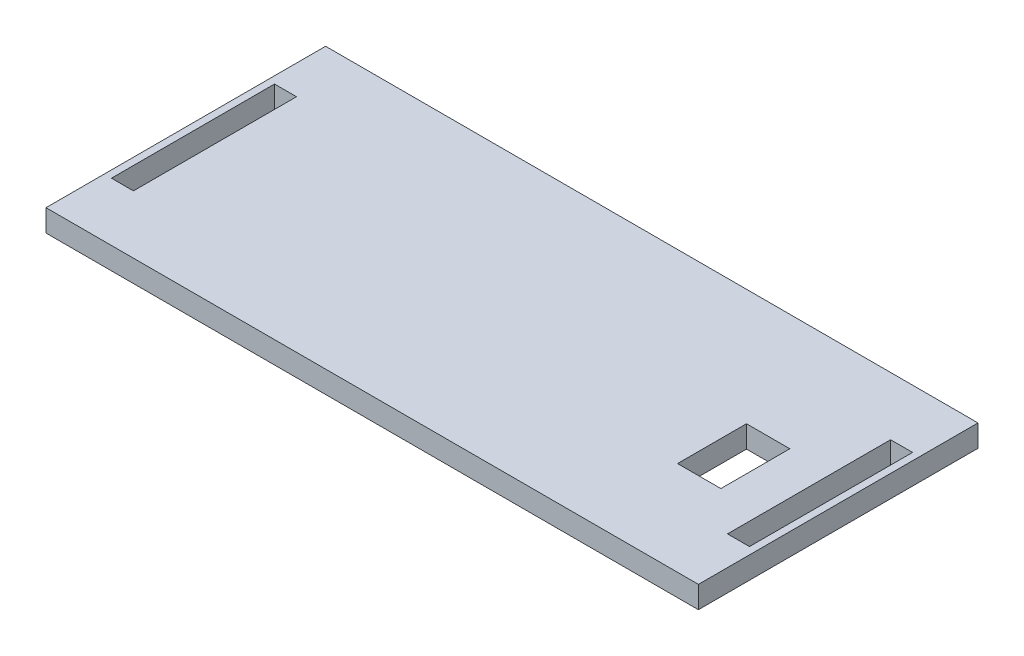
ISO-10303-21;
HEADER;
FILE_DESCRIPTION(('STEP AP214'),'2;1');
FILE_NAME('part.step','',(''),(''),'','','');
FILE_SCHEMA(('AUTOMOTIVE_DESIGN { 1 0 10303 214 1 1 1 1 }'));
ENDSEC;
DATA;
#1=APPLICATION_CONTEXT('core data for automotive mechanical design processes');
#2=APPLICATION_PROTOCOL_DEFINITION('international standard','automotive_design',2000,#1);
#3=PRODUCT_CONTEXT('',#1,'mechanical');
#4=PRODUCT('Part','Part','',(#3));
#5=PRODUCT_RELATED_PRODUCT_CATEGORY('part','',(#4));
#6=PRODUCT_DEFINITION_FORMATION('','',#4);
#7=PRODUCT_DEFINITION_CONTEXT('part definition',#1,'design');
#8=PRODUCT_DEFINITION('design','',#6,#7);
#9=PRODUCT_DEFINITION_SHAPE('','',#8);
#10=(LENGTH_UNIT() NAMED_UNIT(*) SI_UNIT(.MILLI.,.METRE.));
#11=(NAMED_UNIT(*) PLANE_ANGLE_UNIT() SI_UNIT($,.RADIAN.));
#12=(NAMED_UNIT(*) SI_UNIT($,.STERADIAN.) SOLID_ANGLE_UNIT());
#13=UNCERTAINTY_MEASURE_WITH_UNIT(LENGTH_MEASURE(1.E-05),#10,'distance_accuracy_value','');
#14=(GEOMETRIC_REPRESENTATION_CONTEXT(3) GLOBAL_UNCERTAINTY_ASSIGNED_CONTEXT((#13)) GLOBAL_UNIT_ASSIGNED_CONTEXT((#10,
#11,#12)) REPRESENTATION_CONTEXT('',''));
#15=CARTESIAN_POINT('',(0.,0.,0.));
#16=DIRECTION('',(0.,0.,1.));
#17=DIRECTION('',(1.,0.,0.));
#18=AXIS2_PLACEMENT_3D('',#15,#16,#17);
#19=CARTESIAN_POINT('',(0.,5.9944,0.));
#20=DIRECTION('',(0.,1.,0.));
#21=DIRECTION('',(0.,0.,1.));
#22=AXIS2_PLACEMENT_3D('',#19,#20,#21);
#23=PLANE('',#22);
#24=DIRECTION('',(0.,0.,1.));
#25=VECTOR('',#24,1.);
#26=CARTESIAN_POINT('',(0.,5.9944,0.));
#27=LINE('',#26,#25);
#28=CARTESIAN_POINT('',(0.,5.9944,0.));
#29=VERTEX_POINT('',#28);
#30=CARTESIAN_POINT('',(0.,5.9944,76.2));
#31=VERTEX_POINT('',#30);
#32=EDGE_CURVE('E291',#29,#31,#27,.T.);
#33=ORIENTED_EDGE('',*,*,#32,.T.);
#34=DIRECTION('',(1.,0.,0.));
#35=VECTOR('',#34,1.);
#36=CARTESIAN_POINT('',(0.,5.9944,76.2));
#37=LINE('',#36,#35);
#38=CARTESIAN_POINT('',(177.8,5.9944,76.2));
#39=VERTEX_POINT('',#38);
#40=EDGE_CURVE('E295',#31,#39,#37,.T.);
#41=ORIENTED_EDGE('',*,*,#40,.T.);
#42=DIRECTION('',(0.,0.,-1.));
#43=VECTOR('',#42,1.);
#44=CARTESIAN_POINT('',(177.8,5.9944,0.));
#45=LINE('',#44,#43);
#46=CARTESIAN_POINT('',(177.8,5.9944,0.));
#47=VERTEX_POINT('',#46);
#48=EDGE_CURVE('E299',#39,#47,#45,.T.);
#49=ORIENTED_EDGE('',*,*,#48,.T.);
#50=DIRECTION('',(-1.,0.,0.));
#51=VECTOR('',#50,1.);
#52=CARTESIAN_POINT('',(0.,5.9944,0.));
#53=LINE('',#52,#51);
#54=EDGE_CURVE('E302',#47,#29,#53,.T.);
#55=ORIENTED_EDGE('',*,*,#54,.T.);
#56=EDGE_LOOP('',(#33,#41,#49,#55));
#57=FACE_BOUND('',#56,.T.);
#58=DIRECTION('',(1.,0.,0.));
#59=VECTOR('',#58,1.);
#60=CARTESIAN_POINT('',(1.95480000200001,5.9944,60.325));
#61=LINE('',#60,#59);
#62=CARTESIAN_POINT('',(1.95480000200001,5.9944,60.325));
#63=VERTEX_POINT('',#62);
#64=CARTESIAN_POINT('',(7.94920000200001,5.9944,60.325));
#65=VERTEX_POINT('',#64);
#66=EDGE_CURVE('E251',#63,#65,#61,.T.);
#67=ORIENTED_EDGE('',*,*,#66,.F.);
#68=DIRECTION('',(0.,0.,1.));
#69=VECTOR('',#68,1.);
#70=CARTESIAN_POINT('',(1.95480000200001,5.9944,15.875));
#71=LINE('',#70,#69);
#72=CARTESIAN_POINT('',(1.95480000200001,5.9944,15.875));
#73=VERTEX_POINT('',#72);
#74=EDGE_CURVE('E248',#73,#63,#71,.T.);
#75=ORIENTED_EDGE('',*,*,#74,.F.);
#76=DIRECTION('',(-1.,0.,0.));
#77=VECTOR('',#76,1.);
#78=CARTESIAN_POINT('',(1.95480000200001,5.9944,15.875));
#79=LINE('',#78,#77);
#80=CARTESIAN_POINT('',(7.94920000200001,5.9944,15.875));
#81=VERTEX_POINT('',#80);
#82=EDGE_CURVE('E259',#81,#73,#79,.T.);
#83=ORIENTED_EDGE('',*,*,#82,.F.);
#84=DIRECTION('',(0.,0.,-1.));
#85=VECTOR('',#84,1.);
#86=CARTESIAN_POINT('',(7.94920000200001,5.9944,15.875));
#87=LINE('',#86,#85);
#88=EDGE_CURVE('E255',#65,#81,#87,.T.);
#89=ORIENTED_EDGE('',*,*,#88,.F.);
#90=EDGE_LOOP('',(#67,#75,#83,#89));
#91=FACE_BOUND('',#90,.T.);
#92=DIRECTION('',(-1.,0.,0.));
#93=VECTOR('',#92,1.);
#94=CARTESIAN_POINT('',(175.845199998,5.9944,15.875));
#95=LINE('',#94,#93);
#96=CARTESIAN_POINT('',(175.845199998,5.9944,15.875));
#97=VERTEX_POINT('',#96);
#98=CARTESIAN_POINT('',(169.850799998,5.9944,15.875));
#99=VERTEX_POINT('',#98);
#100=EDGE_CURVE('E208',#97,#99,#95,.T.);
#101=ORIENTED_EDGE('',*,*,#100,.F.);
#102=DIRECTION('',(0.,0.,-1.));
#103=VECTOR('',#102,1.);
#104=CARTESIAN_POINT('',(175.845199998,5.9944,15.875));
#105=LINE('',#104,#103);
#106=CARTESIAN_POINT('',(175.845199998,5.9944,60.325));
#107=VERTEX_POINT('',#106);
#108=EDGE_CURVE('E205',#107,#97,#105,.T.);
#109=ORIENTED_EDGE('',*,*,#108,.F.);
#110=DIRECTION('',(1.,0.,0.));
#111=VECTOR('',#110,1.);
#112=CARTESIAN_POINT('',(175.845199998,5.9944,60.325));
#113=LINE('',#112,#111);
#114=CARTESIAN_POINT('',(169.850799998,5.9944,60.325));
#115=VERTEX_POINT('',#114);
#116=EDGE_CURVE('E216',#115,#107,#113,.T.);
#117=ORIENTED_EDGE('',*,*,#116,.F.);
#118=DIRECTION('',(0.,0.,1.));
#119=VECTOR('',#118,1.);
#120=CARTESIAN_POINT('',(169.850799998,5.9944,15.875));
#121=LINE('',#120,#119);
#122=EDGE_CURVE('E212',#99,#115,#121,.T.);
#123=ORIENTED_EDGE('',*,*,#122,.F.);
#124=EDGE_LOOP('',(#101,#109,#117,#123));
#125=FACE_BOUND('',#124,.T.);
#126=DIRECTION('',(-1.,0.,0.));
#127=VECTOR('',#126,1.);
#128=CARTESIAN_POINT('',(158.255699998,5.9944,31.7373));
#129=LINE('',#128,#127);
#130=CARTESIAN_POINT('',(158.255699998,5.9944,31.7373));
#131=VERTEX_POINT('',#130);
#132=CARTESIAN_POINT('',(146.444699998,5.9944,31.7373));
#133=VERTEX_POINT('',#132);
#134=EDGE_CURVE('E166',#131,#133,#129,.T.);
#135=ORIENTED_EDGE('',*,*,#134,.F.);
#136=DIRECTION('',(0.,0.,-1.));
#137=VECTOR('',#136,1.);
#138=CARTESIAN_POINT('',(158.255699998,5.9944,31.7373));
#139=LINE('',#138,#137);
#140=CARTESIAN_POINT('',(158.255699998,5.9944,50.5333));
#141=VERTEX_POINT('',#140);
#142=EDGE_CURVE('E157',#141,#131,#139,.T.);
#143=ORIENTED_EDGE('',*,*,#142,.F.);
#144=DIRECTION('',(1.,0.,0.));
#145=VECTOR('',#144,1.);
#146=CARTESIAN_POINT('',(158.255699998,5.9944,50.5333));
#147=LINE('',#146,#145);
#148=CARTESIAN_POINT('',(146.444699998,5.9944,50.5333));
#149=VERTEX_POINT('',#148);
#150=EDGE_CURVE('E183',#149,#141,#147,.T.);
#151=ORIENTED_EDGE('',*,*,#150,.F.);
#152=DIRECTION('',(0.,0.,1.));
#153=VECTOR('',#152,1.);
#154=CARTESIAN_POINT('',(146.444699998,5.9944,31.7373));
#155=LINE('',#154,#153);
#156=EDGE_CURVE('E179',#133,#149,#155,.T.);
#157=ORIENTED_EDGE('',*,*,#156,.F.);
#158=EDGE_LOOP('',(#135,#143,#151,#157));
#159=FACE_BOUND('',#158,.T.);
#160=ADVANCED_FACE('F43',(#57,#91,#125,#159),#23,.T.);
#161=CARTESIAN_POINT('',(0.,0.,0.));
#162=DIRECTION('',(0.,1.,0.));
#163=DIRECTION('',(0.,0.,1.));
#164=AXIS2_PLACEMENT_3D('',#161,#162,#163);
#165=PLANE('',#164);
#166=DIRECTION('',(0.,0.,-1.));
#167=VECTOR('',#166,1.);
#168=CARTESIAN_POINT('',(175.845199998,0.,15.875));
#169=LINE('',#168,#167);
#170=CARTESIAN_POINT('',(175.845199998,0.,60.325));
#171=VERTEX_POINT('',#170);
#172=CARTESIAN_POINT('',(175.845199998,0.,15.875));
#173=VERTEX_POINT('',#172);
#174=EDGE_CURVE('E175',#171,#173,#169,.T.);
#175=ORIENTED_EDGE('',*,*,#174,.T.);
#176=DIRECTION('',(-1.,0.,0.));
#177=VECTOR('',#176,1.);
#178=CARTESIAN_POINT('',(175.845199998,0.,15.875));
#179=LINE('',#178,#177);
#180=CARTESIAN_POINT('',(169.850799998,0.,15.875));
#181=VERTEX_POINT('',#180);
#182=EDGE_CURVE('E223',#173,#181,#179,.T.);
#183=ORIENTED_EDGE('',*,*,#182,.T.);
#184=DIRECTION('',(0.,0.,1.));
#185=VECTOR('',#184,1.);
#186=CARTESIAN_POINT('',(169.850799998,0.,15.875));
#187=LINE('',#186,#185);
#188=CARTESIAN_POINT('',(169.850799998,0.,60.325));
#189=VERTEX_POINT('',#188);
#190=EDGE_CURVE('E227',#181,#189,#187,.T.);
#191=ORIENTED_EDGE('',*,*,#190,.T.);
#192=DIRECTION('',(1.,0.,0.));
#193=VECTOR('',#192,1.);
#194=CARTESIAN_POINT('',(175.845199998,0.,60.325));
#195=LINE('',#194,#193);
#196=EDGE_CURVE('E209',#189,#171,#195,.T.);
#197=ORIENTED_EDGE('',*,*,#196,.T.);
#198=EDGE_LOOP('',(#175,#183,#191,#197));
#199=FACE_BOUND('',#198,.T.);
#200=DIRECTION('',(0.,0.,1.));
#201=VECTOR('',#200,1.);
#202=CARTESIAN_POINT('',(0.,0.,0.));
#203=LINE('',#202,#201);
#204=CARTESIAN_POINT('',(0.,0.,0.));
#205=VERTEX_POINT('',#204);
#206=CARTESIAN_POINT('',(0.,0.,76.2));
#207=VERTEX_POINT('',#206);
#208=EDGE_CURVE('E290',#205,#207,#203,.T.);
#209=ORIENTED_EDGE('',*,*,#208,.F.);
#210=DIRECTION('',(-1.,0.,0.));
#211=VECTOR('',#210,1.);
#212=CARTESIAN_POINT('',(0.,0.,0.));
#213=LINE('',#212,#211);
#214=CARTESIAN_POINT('',(177.8,0.,0.));
#215=VERTEX_POINT('',#214);
#216=EDGE_CURVE('E296',#215,#205,#213,.T.);
#217=ORIENTED_EDGE('',*,*,#216,.F.);
#218=DIRECTION('',(0.,0.,-1.));
#219=VECTOR('',#218,1.);
#220=CARTESIAN_POINT('',(177.8,0.,0.));
#221=LINE('',#220,#219);
#222=CARTESIAN_POINT('',(177.8,0.,76.2));
#223=VERTEX_POINT('',#222);
#224=EDGE_CURVE('E312',#223,#215,#221,.T.);
#225=ORIENTED_EDGE('',*,*,#224,.F.);
#226=DIRECTION('',(1.,0.,0.));
#227=VECTOR('',#226,1.);
#228=CARTESIAN_POINT('',(0.,0.,76.2));
#229=LINE('',#228,#227);
#230=EDGE_CURVE('E309',#207,#223,#229,.T.);
#231=ORIENTED_EDGE('',*,*,#230,.F.);
#232=EDGE_LOOP('',(#209,#217,#225,#231));
#233=FACE_BOUND('',#232,.T.);
#234=DIRECTION('',(0.,0.,1.));
#235=VECTOR('',#234,1.);
#236=CARTESIAN_POINT('',(1.95480000200001,0.,15.875));
#237=LINE('',#236,#235);
#238=CARTESIAN_POINT('',(1.95480000200001,0.,15.875));
#239=VERTEX_POINT('',#238);
#240=CARTESIAN_POINT('',(1.95480000200001,0.,60.325));
#241=VERTEX_POINT('',#240);
#242=EDGE_CURVE('E247',#239,#241,#237,.T.);
#243=ORIENTED_EDGE('',*,*,#242,.T.);
#244=DIRECTION('',(1.,0.,0.));
#245=VECTOR('',#244,1.);
#246=CARTESIAN_POINT('',(1.95480000200001,0.,60.325));
#247=LINE('',#246,#245);
#248=CARTESIAN_POINT('',(7.94920000200001,0.,60.325));
#249=VERTEX_POINT('',#248);
#250=EDGE_CURVE('E266',#241,#249,#247,.T.);
#251=ORIENTED_EDGE('',*,*,#250,.T.);
#252=DIRECTION('',(0.,0.,-1.));
#253=VECTOR('',#252,1.);
#254=CARTESIAN_POINT('',(7.94920000200001,0.,15.875));
#255=LINE('',#254,#253);
#256=CARTESIAN_POINT('',(7.94920000200001,0.,15.875));
#257=VERTEX_POINT('',#256);
#258=EDGE_CURVE('E270',#249,#257,#255,.T.);
#259=ORIENTED_EDGE('',*,*,#258,.T.);
#260=DIRECTION('',(-1.,0.,0.));
#261=VECTOR('',#260,1.);
#262=CARTESIAN_POINT('',(1.95480000200001,0.,15.875));
#263=LINE('',#262,#261);
#264=EDGE_CURVE('E252',#257,#239,#263,.T.);
#265=ORIENTED_EDGE('',*,*,#264,.T.);
#266=EDGE_LOOP('',(#243,#251,#259,#265));
#267=FACE_BOUND('',#266,.T.);
#268=DIRECTION('',(0.,0.,-1.));
#269=VECTOR('',#268,1.);
#270=CARTESIAN_POINT('',(158.255699998,0.,31.7373));
#271=LINE('',#270,#269);
#272=CARTESIAN_POINT('',(158.255699998,0.,50.5333));
#273=VERTEX_POINT('',#272);
#274=CARTESIAN_POINT('',(158.255699998,0.,31.7373));
#275=VERTEX_POINT('',#274);
#276=EDGE_CURVE('E67',#273,#275,#271,.T.);
#277=ORIENTED_EDGE('',*,*,#276,.T.);
#278=DIRECTION('',(-1.,0.,0.));
#279=VECTOR('',#278,1.);
#280=CARTESIAN_POINT('',(158.255699998,0.,31.7373));
#281=LINE('',#280,#279);
#282=CARTESIAN_POINT('',(146.444699998,0.,31.7373));
#283=VERTEX_POINT('',#282);
#284=EDGE_CURVE('E173',#275,#283,#281,.T.);
#285=ORIENTED_EDGE('',*,*,#284,.T.);
#286=DIRECTION('',(0.,0.,1.));
#287=VECTOR('',#286,1.);
#288=CARTESIAN_POINT('',(146.444699998,0.,31.7373));
#289=LINE('',#288,#287);
#290=CARTESIAN_POINT('',(146.444699998,0.,50.5333));
#291=VERTEX_POINT('',#290);
#292=EDGE_CURVE('E192',#283,#291,#289,.T.);
#293=ORIENTED_EDGE('',*,*,#292,.T.);
#294=DIRECTION('',(1.,0.,0.));
#295=VECTOR('',#294,1.);
#296=CARTESIAN_POINT('',(158.255699998,0.,50.5333));
#297=LINE('',#296,#295);
#298=EDGE_CURVE('E167',#291,#273,#297,.T.);
#299=ORIENTED_EDGE('',*,*,#298,.T.);
#300=EDGE_LOOP('',(#277,#285,#293,#299));
#301=FACE_BOUND('',#300,.T.);
#302=ADVANCED_FACE('F335',(#199,#233,#267,#301),#165,.F.);
#303=CARTESIAN_POINT('',(0.,5.9944,0.));
#304=DIRECTION('',(1.,0.,0.));
#305=DIRECTION('',(0.,0.,-1.));
#306=AXIS2_PLACEMENT_3D('',#303,#304,#305);
#307=PLANE('',#306);
#308=ORIENTED_EDGE('',*,*,#208,.T.);
#309=DIRECTION('',(0.,-1.,0.));
#310=VECTOR('',#309,1.);
#311=CARTESIAN_POINT('',(0.,5.9944,76.2));
#312=LINE('',#311,#310);
#313=EDGE_CURVE('E11',#31,#207,#312,.T.);
#314=ORIENTED_EDGE('',*,*,#313,.F.);
#315=ORIENTED_EDGE('',*,*,#32,.F.);
#316=DIRECTION('',(0.,-1.,0.));
#317=VECTOR('',#316,1.);
#318=CARTESIAN_POINT('',(0.,5.9944,0.));
#319=LINE('',#318,#317);
#320=EDGE_CURVE('E305',#29,#205,#319,.T.);
#321=ORIENTED_EDGE('',*,*,#320,.T.);
#322=EDGE_LOOP('',(#308,#314,#315,#321));
#323=FACE_BOUND('',#322,.T.);
#324=ADVANCED_FACE('F45',(#323),#307,.F.);
#325=CARTESIAN_POINT('',(0.,5.9944,76.2));
#326=DIRECTION('',(0.,0.,-1.));
#327=DIRECTION('',(-1.,0.,0.));
#328=AXIS2_PLACEMENT_3D('',#325,#326,#327);
#329=PLANE('',#328);
#330=ORIENTED_EDGE('',*,*,#230,.T.);
#331=DIRECTION('',(0.,-1.,0.));
#332=VECTOR('',#331,1.);
#333=CARTESIAN_POINT('',(177.8,5.9944,76.2));
#334=LINE('',#333,#332);
#335=EDGE_CURVE('E52',#39,#223,#334,.T.);
#336=ORIENTED_EDGE('',*,*,#335,.F.);
#337=ORIENTED_EDGE('',*,*,#40,.F.);
#338=ORIENTED_EDGE('',*,*,#313,.T.);
#339=EDGE_LOOP('',(#330,#336,#337,#338));
#340=FACE_BOUND('',#339,.T.);
#341=ADVANCED_FACE('F346',(#340),#329,.F.);
#342=CARTESIAN_POINT('',(177.8,5.9944,0.));
#343=DIRECTION('',(-1.,0.,0.));
#344=DIRECTION('',(0.,0.,1.));
#345=AXIS2_PLACEMENT_3D('',#342,#343,#344);
#346=PLANE('',#345);
#347=ORIENTED_EDGE('',*,*,#224,.T.);
#348=DIRECTION('',(0.,-1.,0.));
#349=VECTOR('',#348,1.);
#350=CARTESIAN_POINT('',(177.8,5.9944,0.));
#351=LINE('',#350,#349);
#352=EDGE_CURVE('E320',#47,#215,#351,.T.);
#353=ORIENTED_EDGE('',*,*,#352,.F.);
#354=ORIENTED_EDGE('',*,*,#48,.F.);
#355=ORIENTED_EDGE('',*,*,#335,.T.);
#356=EDGE_LOOP('',(#347,#353,#354,#355));
#357=FACE_BOUND('',#356,.T.);
#358=ADVANCED_FACE('F329',(#357),#346,.F.);
#359=CARTESIAN_POINT('',(0.,5.9944,0.));
#360=DIRECTION('',(0.,0.,1.));
#361=DIRECTION('',(1.,0.,0.));
#362=AXIS2_PLACEMENT_3D('',#359,#360,#361);
#363=PLANE('',#362);
#364=ORIENTED_EDGE('',*,*,#216,.T.);
#365=ORIENTED_EDGE('',*,*,#320,.F.);
#366=ORIENTED_EDGE('',*,*,#54,.F.);
#367=ORIENTED_EDGE('',*,*,#352,.T.);
#368=EDGE_LOOP('',(#364,#365,#366,#367));
#369=FACE_BOUND('',#368,.T.);
#370=ADVANCED_FACE('F339',(#369),#363,.F.);
#371=CARTESIAN_POINT('',(1.95480000200001,5.9944,15.875));
#372=DIRECTION('',(1.,0.,0.));
#373=DIRECTION('',(0.,0.,-1.));
#374=AXIS2_PLACEMENT_3D('',#371,#372,#373);
#375=PLANE('',#374);
#376=ORIENTED_EDGE('',*,*,#242,.F.);
#377=DIRECTION('',(0.,-1.,0.));
#378=VECTOR('',#377,1.);
#379=CARTESIAN_POINT('',(1.95480000200001,5.9944,15.875));
#380=LINE('',#379,#378);
#381=EDGE_CURVE('E262',#73,#239,#380,.T.);
#382=ORIENTED_EDGE('',*,*,#381,.F.);
#383=ORIENTED_EDGE('',*,*,#74,.T.);
#384=DIRECTION('',(0.,-1.,0.));
#385=VECTOR('',#384,1.);
#386=CARTESIAN_POINT('',(1.95480000200001,5.9944,60.325));
#387=LINE('',#386,#385);
#388=EDGE_CURVE('E286',#63,#241,#387,.T.);
#389=ORIENTED_EDGE('',*,*,#388,.T.);
#390=EDGE_LOOP('',(#376,#382,#383,#389));
#391=FACE_BOUND('',#390,.T.);
#392=ADVANCED_FACE('F361',(#391),#375,.T.);
#393=CARTESIAN_POINT('',(1.95480000200001,5.9944,60.325));
#394=DIRECTION('',(0.,0.,-1.));
#395=DIRECTION('',(-1.,0.,0.));
#396=AXIS2_PLACEMENT_3D('',#393,#394,#395);
#397=PLANE('',#396);
#398=ORIENTED_EDGE('',*,*,#250,.F.);
#399=ORIENTED_EDGE('',*,*,#388,.F.);
#400=ORIENTED_EDGE('',*,*,#66,.T.);
#401=DIRECTION('',(0.,-1.,0.));
#402=VECTOR('',#401,1.);
#403=CARTESIAN_POINT('',(7.94920000200001,5.9944,60.325));
#404=LINE('',#403,#402);
#405=EDGE_CURVE('E283',#65,#249,#404,.T.);
#406=ORIENTED_EDGE('',*,*,#405,.T.);
#407=EDGE_LOOP('',(#398,#399,#400,#406));
#408=FACE_BOUND('',#407,.T.);
#409=ADVANCED_FACE('F368',(#408),#397,.T.);
#410=CARTESIAN_POINT('',(7.94920000200001,5.9944,15.875));
#411=DIRECTION('',(-1.,0.,0.));
#412=DIRECTION('',(0.,0.,1.));
#413=AXIS2_PLACEMENT_3D('',#410,#411,#412);
#414=PLANE('',#413);
#415=ORIENTED_EDGE('',*,*,#258,.F.);
#416=ORIENTED_EDGE('',*,*,#405,.F.);
#417=ORIENTED_EDGE('',*,*,#88,.T.);
#418=DIRECTION('',(0.,-1.,0.));
#419=VECTOR('',#418,1.);
#420=CARTESIAN_POINT('',(7.94920000200001,5.9944,15.875));
#421=LINE('',#420,#419);
#422=EDGE_CURVE('E280',#81,#257,#421,.T.);
#423=ORIENTED_EDGE('',*,*,#422,.T.);
#424=EDGE_LOOP('',(#415,#416,#417,#423));
#425=FACE_BOUND('',#424,.T.);
#426=ADVANCED_FACE('F373',(#425),#414,.T.);
#427=CARTESIAN_POINT('',(1.95480000200001,5.9944,15.875));
#428=DIRECTION('',(0.,0.,1.));
#429=DIRECTION('',(1.,0.,0.));
#430=AXIS2_PLACEMENT_3D('',#427,#428,#429);
#431=PLANE('',#430);
#432=ORIENTED_EDGE('',*,*,#264,.F.);
#433=ORIENTED_EDGE('',*,*,#422,.F.);
#434=ORIENTED_EDGE('',*,*,#82,.T.);
#435=ORIENTED_EDGE('',*,*,#381,.T.);
#436=EDGE_LOOP('',(#432,#433,#434,#435));
#437=FACE_BOUND('',#436,.T.);
#438=ADVANCED_FACE('F380',(#437),#431,.T.);
#439=CARTESIAN_POINT('',(175.845199998,5.9944,15.875));
#440=DIRECTION('',(-1.,0.,0.));
#441=DIRECTION('',(0.,0.,1.));
#442=AXIS2_PLACEMENT_3D('',#439,#440,#441);
#443=PLANE('',#442);
#444=ORIENTED_EDGE('',*,*,#174,.F.);
#445=DIRECTION('',(0.,-1.,0.));
#446=VECTOR('',#445,1.);
#447=CARTESIAN_POINT('',(175.845199998,5.9944,60.325));
#448=LINE('',#447,#446);
#449=EDGE_CURVE('E219',#107,#171,#448,.T.);
#450=ORIENTED_EDGE('',*,*,#449,.F.);
#451=ORIENTED_EDGE('',*,*,#108,.T.);
#452=DIRECTION('',(0.,-1.,0.));
#453=VECTOR('',#452,1.);
#454=CARTESIAN_POINT('',(175.845199998,5.9944,15.875));
#455=LINE('',#454,#453);
#456=EDGE_CURVE('E243',#97,#173,#455,.T.);
#457=ORIENTED_EDGE('',*,*,#456,.T.);
#458=EDGE_LOOP('',(#444,#450,#451,#457));
#459=FACE_BOUND('',#458,.T.);
#460=ADVANCED_FACE('F402',(#459),#443,.T.);
#461=CARTESIAN_POINT('',(175.845199998,5.9944,15.875));
#462=DIRECTION('',(0.,0.,1.));
#463=DIRECTION('',(1.,0.,0.));
#464=AXIS2_PLACEMENT_3D('',#461,#462,#463);
#465=PLANE('',#464);
#466=ORIENTED_EDGE('',*,*,#182,.F.);
#467=ORIENTED_EDGE('',*,*,#456,.F.);
#468=ORIENTED_EDGE('',*,*,#100,.T.);
#469=DIRECTION('',(0.,-1.,0.));
#470=VECTOR('',#469,1.);
#471=CARTESIAN_POINT('',(169.850799998,5.9944,15.875));
#472=LINE('',#471,#470);
#473=EDGE_CURVE('E240',#99,#181,#472,.T.);
#474=ORIENTED_EDGE('',*,*,#473,.T.);
#475=EDGE_LOOP('',(#466,#467,#468,#474));
#476=FACE_BOUND('',#475,.T.);
#477=ADVANCED_FACE('F396',(#476),#465,.T.);
#478=CARTESIAN_POINT('',(169.850799998,5.9944,15.875));
#479=DIRECTION('',(1.,0.,0.));
#480=DIRECTION('',(0.,0.,-1.));
#481=AXIS2_PLACEMENT_3D('',#478,#479,#480);
#482=PLANE('',#481);
#483=ORIENTED_EDGE('',*,*,#190,.F.);
#484=ORIENTED_EDGE('',*,*,#473,.F.);
#485=ORIENTED_EDGE('',*,*,#122,.T.);
#486=DIRECTION('',(0.,-1.,0.));
#487=VECTOR('',#486,1.);
#488=CARTESIAN_POINT('',(169.850799998,5.9944,60.325));
#489=LINE('',#488,#487);
#490=EDGE_CURVE('E237',#115,#189,#489,.T.);
#491=ORIENTED_EDGE('',*,*,#490,.T.);
#492=EDGE_LOOP('',(#483,#484,#485,#491));
#493=FACE_BOUND('',#492,.T.);
#494=ADVANCED_FACE('F399',(#493),#482,.T.);
#495=CARTESIAN_POINT('',(175.845199998,5.9944,60.325));
#496=DIRECTION('',(0.,0.,-1.));
#497=DIRECTION('',(-1.,0.,0.));
#498=AXIS2_PLACEMENT_3D('',#495,#496,#497);
#499=PLANE('',#498);
#500=ORIENTED_EDGE('',*,*,#196,.F.);
#501=ORIENTED_EDGE('',*,*,#490,.F.);
#502=ORIENTED_EDGE('',*,*,#116,.T.);
#503=ORIENTED_EDGE('',*,*,#449,.T.);
#504=EDGE_LOOP('',(#500,#501,#502,#503));
#505=FACE_BOUND('',#504,.T.);
#506=ADVANCED_FACE('F405',(#505),#499,.T.);
#507=CARTESIAN_POINT('',(158.255699998,5.9944,31.7373));
#508=DIRECTION('',(-1.,0.,0.));
#509=DIRECTION('',(0.,0.,1.));
#510=AXIS2_PLACEMENT_3D('',#507,#508,#509);
#511=PLANE('',#510);
#512=ORIENTED_EDGE('',*,*,#276,.F.);
#513=DIRECTION('',(0.,-1.,0.));
#514=VECTOR('',#513,1.);
#515=CARTESIAN_POINT('',(158.255699998,5.9944,50.5333));
#516=LINE('',#515,#514);
#517=EDGE_CURVE('E161',#141,#273,#516,.T.);
#518=ORIENTED_EDGE('',*,*,#517,.F.);
#519=ORIENTED_EDGE('',*,*,#142,.T.);
#520=DIRECTION('',(0.,-1.,0.));
#521=VECTOR('',#520,1.);
#522=CARTESIAN_POINT('',(158.255699998,5.9944,31.7373));
#523=LINE('',#522,#521);
#524=EDGE_CURVE('E160',#131,#275,#523,.T.);
#525=ORIENTED_EDGE('',*,*,#524,.T.);
#526=EDGE_LOOP('',(#512,#518,#519,#525));
#527=FACE_BOUND('',#526,.T.);
#528=ADVANCED_FACE('F159',(#527),#511,.T.);
#529=CARTESIAN_POINT('',(158.255699998,5.9944,31.7373));
#530=DIRECTION('',(0.,0.,1.));
#531=DIRECTION('',(1.,0.,0.));
#532=AXIS2_PLACEMENT_3D('',#529,#530,#531);
#533=PLANE('',#532);
#534=ORIENTED_EDGE('',*,*,#284,.F.);
#535=ORIENTED_EDGE('',*,*,#524,.F.);
#536=ORIENTED_EDGE('',*,*,#134,.T.);
#537=DIRECTION('',(0.,-1.,0.));
#538=VECTOR('',#537,1.);
#539=CARTESIAN_POINT('',(146.444699998,5.9944,31.7373));
#540=LINE('',#539,#538);
#541=EDGE_CURVE('E176',#133,#283,#540,.T.);
#542=ORIENTED_EDGE('',*,*,#541,.T.);
#543=EDGE_LOOP('',(#534,#535,#536,#542));
#544=FACE_BOUND('',#543,.T.);
#545=ADVANCED_FACE('F170',(#544),#533,.T.);
#546=CARTESIAN_POINT('',(146.444699998,5.9944,31.7373));
#547=DIRECTION('',(1.,0.,0.));
#548=DIRECTION('',(0.,0.,-1.));
#549=AXIS2_PLACEMENT_3D('',#546,#547,#548);
#550=PLANE('',#549);
#551=ORIENTED_EDGE('',*,*,#292,.F.);
#552=ORIENTED_EDGE('',*,*,#541,.F.);
#553=ORIENTED_EDGE('',*,*,#156,.T.);
#554=DIRECTION('',(0.,-1.,0.));
#555=VECTOR('',#554,1.);
#556=CARTESIAN_POINT('',(146.444699998,5.9944,50.5333));
#557=LINE('',#556,#555);
#558=EDGE_CURVE('E59',#149,#291,#557,.T.);
#559=ORIENTED_EDGE('',*,*,#558,.T.);
#560=EDGE_LOOP('',(#551,#552,#553,#559));
#561=FACE_BOUND('',#560,.T.);
#562=ADVANCED_FACE('F465',(#561),#550,.T.);
#563=CARTESIAN_POINT('',(158.255699998,5.9944,50.5333));
#564=DIRECTION('',(0.,0.,-1.));
#565=DIRECTION('',(-1.,0.,0.));
#566=AXIS2_PLACEMENT_3D('',#563,#564,#565);
#567=PLANE('',#566);
#568=ORIENTED_EDGE('',*,*,#298,.F.);
#569=ORIENTED_EDGE('',*,*,#558,.F.);
#570=ORIENTED_EDGE('',*,*,#150,.T.);
#571=ORIENTED_EDGE('',*,*,#517,.T.);
#572=EDGE_LOOP('',(#568,#569,#570,#571));
#573=FACE_BOUND('',#572,.T.);
#574=ADVANCED_FACE('F474',(#573),#567,.T.);
#575=CLOSED_SHELL('',(#160,#302,#324,#341,#358,#370,#392,#409,#426,#438,#460,#477,#494,#506,
#528,#545,#562,#574));
#576=MANIFOLD_SOLID_BREP('B2',#575);
#577=ADVANCED_BREP_SHAPE_REPRESENTATION('',(#18,#576),#14);
#578=SHAPE_DEFINITION_REPRESENTATION(#9,#577);
ENDSEC;
END-ISO-10303-21;
